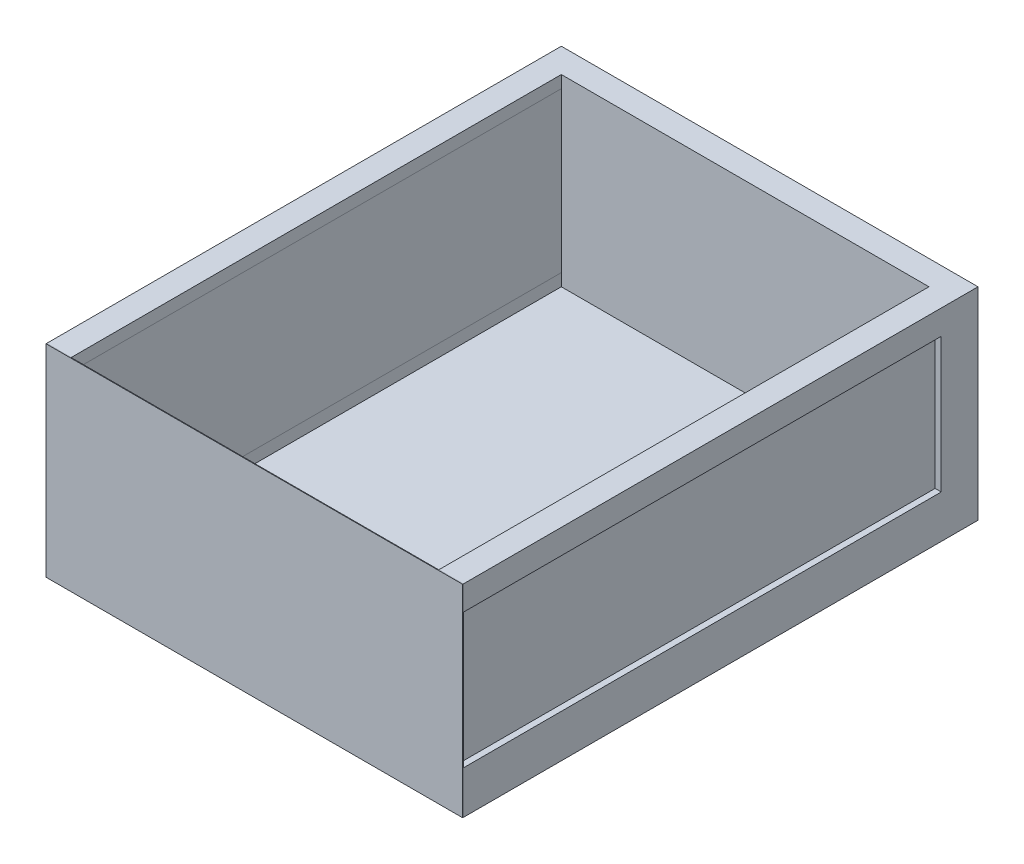
ISO-10303-21;
HEADER;
FILE_DESCRIPTION(('STEP AP214'),'2;1');
FILE_NAME('part.step','',(''),(''),'','','');
FILE_SCHEMA(('AUTOMOTIVE_DESIGN { 1 0 10303 214 1 1 1 1 }'));
ENDSEC;
DATA;
#1=APPLICATION_CONTEXT('core data for automotive mechanical design processes');
#2=APPLICATION_PROTOCOL_DEFINITION('international standard','automotive_design',2000,#1);
#3=PRODUCT_CONTEXT('',#1,'mechanical');
#4=PRODUCT('Part','Part','',(#3));
#5=PRODUCT_RELATED_PRODUCT_CATEGORY('part','',(#4));
#6=PRODUCT_DEFINITION_FORMATION('','',#4);
#7=PRODUCT_DEFINITION_CONTEXT('part definition',#1,'design');
#8=PRODUCT_DEFINITION('design','',#6,#7);
#9=PRODUCT_DEFINITION_SHAPE('','',#8);
#10=(LENGTH_UNIT() NAMED_UNIT(*) SI_UNIT(.MILLI.,.METRE.));
#11=(NAMED_UNIT(*) PLANE_ANGLE_UNIT() SI_UNIT($,.RADIAN.));
#12=(NAMED_UNIT(*) SI_UNIT($,.STERADIAN.) SOLID_ANGLE_UNIT());
#13=UNCERTAINTY_MEASURE_WITH_UNIT(LENGTH_MEASURE(1.E-05),#10,'distance_accuracy_value','');
#14=(GEOMETRIC_REPRESENTATION_CONTEXT(3) GLOBAL_UNCERTAINTY_ASSIGNED_CONTEXT((#13)) GLOBAL_UNIT_ASSIGNED_CONTEXT((#10,
#11,#12)) REPRESENTATION_CONTEXT('',''));
#15=CARTESIAN_POINT('',(0.,0.,0.));
#16=DIRECTION('',(0.,0.,1.));
#17=DIRECTION('',(1.,0.,0.));
#18=AXIS2_PLACEMENT_3D('',#15,#16,#17);
#19=CARTESIAN_POINT('',(-34.,33.,42.1));
#20=DIRECTION('',(1.,0.,0.));
#21=DIRECTION('',(0.,0.,-1.));
#22=AXIS2_PLACEMENT_3D('',#19,#20,#21);
#23=PLANE('',#22);
#24=DIRECTION('',(0.,-1.,0.));
#25=VECTOR('',#24,1.);
#26=CARTESIAN_POINT('',(-34.,33.,42.));
#27=LINE('',#26,#25);
#28=CARTESIAN_POINT('',(-34.,33.,42.));
#29=VERTEX_POINT('',#28);
#30=CARTESIAN_POINT('',(-34.,0.,42.));
#31=VERTEX_POINT('',#30);
#32=EDGE_CURVE('E113',#29,#31,#27,.T.);
#33=ORIENTED_EDGE('',*,*,#32,.T.);
#34=DIRECTION('',(0.,0.,-1.));
#35=VECTOR('',#34,1.);
#36=CARTESIAN_POINT('',(-34.,0.,42.1));
#37=LINE('',#36,#35);
#38=CARTESIAN_POINT('',(-34.,0.,42.1));
#39=VERTEX_POINT('',#38);
#40=EDGE_CURVE('E12',#39,#31,#37,.T.);
#41=ORIENTED_EDGE('',*,*,#40,.F.);
#42=DIRECTION('',(0.,-1.,0.));
#43=VECTOR('',#42,1.);
#44=CARTESIAN_POINT('',(-34.,33.,42.1));
#45=LINE('',#44,#43);
#46=CARTESIAN_POINT('',(-34.,33.,42.1));
#47=VERTEX_POINT('',#46);
#48=EDGE_CURVE('E101',#47,#39,#45,.T.);
#49=ORIENTED_EDGE('',*,*,#48,.F.);
#50=DIRECTION('',(0.,0.,-1.));
#51=VECTOR('',#50,1.);
#52=CARTESIAN_POINT('',(-34.,33.,42.1));
#53=LINE('',#52,#51);
#54=EDGE_CURVE('E109',#47,#29,#53,.T.);
#55=ORIENTED_EDGE('',*,*,#54,.T.);
#56=EDGE_LOOP('',(#33,#41,#49,#55));
#57=FACE_BOUND('',#56,.T.);
#58=ADVANCED_FACE('F50',(#57),#23,.F.);
#59=CARTESIAN_POINT('',(-34.,0.,42.1));
#60=DIRECTION('',(0.,1.,0.));
#61=DIRECTION('',(0.,0.,1.));
#62=AXIS2_PLACEMENT_3D('',#59,#60,#61);
#63=PLANE('',#62);
#64=DIRECTION('',(1.,0.,0.));
#65=VECTOR('',#64,1.);
#66=CARTESIAN_POINT('',(-34.,0.,42.));
#67=LINE('',#66,#65);
#68=CARTESIAN_POINT('',(34.,0.,42.));
#69=VERTEX_POINT('',#68);
#70=EDGE_CURVE('E105',#31,#69,#67,.T.);
#71=ORIENTED_EDGE('',*,*,#70,.T.);
#72=DIRECTION('',(0.,0.,-1.));
#73=VECTOR('',#72,1.);
#74=CARTESIAN_POINT('',(34.,0.,42.1));
#75=LINE('',#74,#73);
#76=CARTESIAN_POINT('',(34.,0.,42.1));
#77=VERTEX_POINT('',#76);
#78=EDGE_CURVE('E58',#77,#69,#75,.T.);
#79=ORIENTED_EDGE('',*,*,#78,.F.);
#80=DIRECTION('',(1.,0.,0.));
#81=VECTOR('',#80,1.);
#82=CARTESIAN_POINT('',(-34.,0.,42.1));
#83=LINE('',#82,#81);
#84=EDGE_CURVE('E96',#39,#77,#83,.T.);
#85=ORIENTED_EDGE('',*,*,#84,.F.);
#86=ORIENTED_EDGE('',*,*,#40,.T.);
#87=EDGE_LOOP('',(#71,#79,#85,#86));
#88=FACE_BOUND('',#87,.T.);
#89=ADVANCED_FACE('F104',(#88),#63,.F.);
#90=CARTESIAN_POINT('',(34.,33.,42.1));
#91=DIRECTION('',(-1.,0.,0.));
#92=DIRECTION('',(0.,0.,1.));
#93=AXIS2_PLACEMENT_3D('',#90,#91,#92);
#94=PLANE('',#93);
#95=DIRECTION('',(0.,1.,0.));
#96=VECTOR('',#95,1.);
#97=CARTESIAN_POINT('',(34.,33.,42.));
#98=LINE('',#97,#96);
#99=CARTESIAN_POINT('',(34.,33.,42.));
#100=VERTEX_POINT('',#99);
#101=EDGE_CURVE('E83',#69,#100,#98,.T.);
#102=ORIENTED_EDGE('',*,*,#101,.T.);
#103=DIRECTION('',(0.,0.,-1.));
#104=VECTOR('',#103,1.);
#105=CARTESIAN_POINT('',(34.,33.,42.1));
#106=LINE('',#105,#104);
#107=CARTESIAN_POINT('',(34.,33.,42.1));
#108=VERTEX_POINT('',#107);
#109=EDGE_CURVE('E106',#108,#100,#106,.T.);
#110=ORIENTED_EDGE('',*,*,#109,.F.);
#111=DIRECTION('',(0.,1.,0.));
#112=VECTOR('',#111,1.);
#113=CARTESIAN_POINT('',(34.,33.,42.1));
#114=LINE('',#113,#112);
#115=EDGE_CURVE('E99',#77,#108,#114,.T.);
#116=ORIENTED_EDGE('',*,*,#115,.F.);
#117=ORIENTED_EDGE('',*,*,#78,.T.);
#118=EDGE_LOOP('',(#102,#110,#116,#117));
#119=FACE_BOUND('',#118,.T.);
#120=ADVANCED_FACE('F107',(#119),#94,.F.);
#121=CARTESIAN_POINT('',(-34.,33.,42.1));
#122=DIRECTION('',(0.,-1.,0.));
#123=DIRECTION('',(0.,0.,-1.));
#124=AXIS2_PLACEMENT_3D('',#121,#122,#123);
#125=PLANE('',#124);
#126=DIRECTION('',(-1.,0.,0.));
#127=VECTOR('',#126,1.);
#128=CARTESIAN_POINT('',(-34.,33.,42.));
#129=LINE('',#128,#127);
#130=EDGE_CURVE('E89',#100,#29,#129,.T.);
#131=ORIENTED_EDGE('',*,*,#130,.T.);
#132=ORIENTED_EDGE('',*,*,#54,.F.);
#133=DIRECTION('',(-1.,0.,0.));
#134=VECTOR('',#133,1.);
#135=CARTESIAN_POINT('',(-34.,33.,42.1));
#136=LINE('',#135,#134);
#137=EDGE_CURVE('E66',#108,#47,#136,.T.);
#138=ORIENTED_EDGE('',*,*,#137,.F.);
#139=ORIENTED_EDGE('',*,*,#109,.T.);
#140=EDGE_LOOP('',(#131,#132,#138,#139));
#141=FACE_BOUND('',#140,.T.);
#142=ADVANCED_FACE('F120',(#141),#125,.F.);
#143=CARTESIAN_POINT('',(0.,0.,42.1));
#144=DIRECTION('',(0.,0.,1.));
#145=DIRECTION('',(1.,0.,0.));
#146=AXIS2_PLACEMENT_3D('',#143,#144,#145);
#147=PLANE('',#146);
#148=ORIENTED_EDGE('',*,*,#48,.T.);
#149=ORIENTED_EDGE('',*,*,#84,.T.);
#150=ORIENTED_EDGE('',*,*,#115,.T.);
#151=ORIENTED_EDGE('',*,*,#137,.T.);
#152=EDGE_LOOP('',(#148,#149,#150,#151));
#153=FACE_BOUND('',#152,.T.);
#154=ADVANCED_FACE('F97',(#153),#147,.T.);
#155=CARTESIAN_POINT('',(0.,0.,42.));
#156=DIRECTION('',(0.,0.,1.));
#157=DIRECTION('',(1.,0.,0.));
#158=AXIS2_PLACEMENT_3D('',#155,#156,#157);
#159=PLANE('',#158);
#160=ORIENTED_EDGE('',*,*,#32,.F.);
#161=ORIENTED_EDGE('',*,*,#130,.F.);
#162=ORIENTED_EDGE('',*,*,#101,.F.);
#163=ORIENTED_EDGE('',*,*,#70,.F.);
#164=EDGE_LOOP('',(#160,#161,#162,#163));
#165=FACE_BOUND('',#164,.T.);
#166=ADVANCED_FACE('F123',(#165),#159,.F.);
#167=CLOSED_SHELL('',(#58,#89,#120,#142,#154,#166));
#168=MANIFOLD_SOLID_BREP('B2',#167);
#169=CARTESIAN_POINT('',(33.,31.,-38.));
#170=DIRECTION('',(0.,0.,-1.));
#171=DIRECTION('',(-1.,0.,0.));
#172=AXIS2_PLACEMENT_3D('',#169,#170,#171);
#173=PLANE('',#172);
#174=DIRECTION('',(0.,-1.,0.));
#175=VECTOR('',#174,1.);
#176=CARTESIAN_POINT('',(30.,31.,-38.));
#177=LINE('',#176,#175);
#178=CARTESIAN_POINT('',(30.,31.,-38.));
#179=VERTEX_POINT('',#178);
#180=CARTESIAN_POINT('',(30.,5.,-38.));
#181=VERTEX_POINT('',#180);
#182=EDGE_CURVE('E248',#179,#181,#177,.T.);
#183=ORIENTED_EDGE('',*,*,#182,.F.);
#184=DIRECTION('',(-1.,0.,0.));
#185=VECTOR('',#184,1.);
#186=CARTESIAN_POINT('',(33.,31.,-38.));
#187=LINE('',#186,#185);
#188=CARTESIAN_POINT('',(33.,31.,-38.));
#189=VERTEX_POINT('',#188);
#190=EDGE_CURVE('E48',#189,#179,#187,.T.);
#191=ORIENTED_EDGE('',*,*,#190,.F.);
#192=DIRECTION('',(0.,-1.,0.));
#193=VECTOR('',#192,1.);
#194=CARTESIAN_POINT('',(33.,31.,-38.));
#195=LINE('',#194,#193);
#196=CARTESIAN_POINT('',(33.,5.,-38.));
#197=VERTEX_POINT('',#196);
#198=EDGE_CURVE('E242',#189,#197,#195,.T.);
#199=ORIENTED_EDGE('',*,*,#198,.T.);
#200=DIRECTION('',(-1.,0.,0.));
#201=VECTOR('',#200,1.);
#202=CARTESIAN_POINT('',(33.,5.,-38.));
#203=LINE('',#202,#201);
#204=EDGE_CURVE('E187',#197,#181,#203,.T.);
#205=ORIENTED_EDGE('',*,*,#204,.T.);
#206=EDGE_LOOP('',(#183,#191,#199,#205));
#207=FACE_BOUND('',#206,.T.);
#208=ADVANCED_FACE('F184',(#207),#173,.T.);
#209=CARTESIAN_POINT('',(33.,31.,-38.));
#210=DIRECTION('',(0.,1.,0.));
#211=DIRECTION('',(0.,0.,1.));
#212=AXIS2_PLACEMENT_3D('',#209,#210,#211);
#213=PLANE('',#212);
#214=DIRECTION('',(0.,0.,-1.));
#215=VECTOR('',#214,1.);
#216=CARTESIAN_POINT('',(30.,31.,-38.));
#217=LINE('',#216,#215);
#218=CARTESIAN_POINT('',(30.,31.,42.));
#219=VERTEX_POINT('',#218);
#220=EDGE_CURVE('E244',#219,#179,#217,.T.);
#221=ORIENTED_EDGE('',*,*,#220,.F.);
#222=DIRECTION('',(-1.,0.,0.));
#223=VECTOR('',#222,1.);
#224=CARTESIAN_POINT('',(33.,31.,42.));
#225=LINE('',#224,#223);
#226=CARTESIAN_POINT('',(33.,31.,42.));
#227=VERTEX_POINT('',#226);
#228=EDGE_CURVE('E193',#227,#219,#225,.T.);
#229=ORIENTED_EDGE('',*,*,#228,.F.);
#230=DIRECTION('',(0.,0.,-1.));
#231=VECTOR('',#230,1.);
#232=CARTESIAN_POINT('',(33.,31.,-38.));
#233=LINE('',#232,#231);
#234=EDGE_CURVE('E239',#227,#189,#233,.T.);
#235=ORIENTED_EDGE('',*,*,#234,.T.);
#236=ORIENTED_EDGE('',*,*,#190,.T.);
#237=EDGE_LOOP('',(#221,#229,#235,#236));
#238=FACE_BOUND('',#237,.T.);
#239=ADVANCED_FACE('F258',(#238),#213,.T.);
#240=CARTESIAN_POINT('',(33.,31.,42.));
#241=DIRECTION('',(0.,0.,1.));
#242=DIRECTION('',(1.,0.,0.));
#243=AXIS2_PLACEMENT_3D('',#240,#241,#242);
#244=PLANE('',#243);
#245=DIRECTION('',(0.,1.,0.));
#246=VECTOR('',#245,1.);
#247=CARTESIAN_POINT('',(30.,31.,42.));
#248=LINE('',#247,#246);
#249=CARTESIAN_POINT('',(30.,5.,42.));
#250=VERTEX_POINT('',#249);
#251=EDGE_CURVE('E234',#250,#219,#248,.T.);
#252=ORIENTED_EDGE('',*,*,#251,.F.);
#253=DIRECTION('',(-1.,0.,0.));
#254=VECTOR('',#253,1.);
#255=CARTESIAN_POINT('',(33.,5.,42.));
#256=LINE('',#255,#254);
#257=CARTESIAN_POINT('',(33.,5.,42.));
#258=VERTEX_POINT('',#257);
#259=EDGE_CURVE('E229',#258,#250,#256,.T.);
#260=ORIENTED_EDGE('',*,*,#259,.F.);
#261=DIRECTION('',(0.,1.,0.));
#262=VECTOR('',#261,1.);
#263=CARTESIAN_POINT('',(33.,31.,42.));
#264=LINE('',#263,#262);
#265=EDGE_CURVE('E232',#258,#227,#264,.T.);
#266=ORIENTED_EDGE('',*,*,#265,.T.);
#267=ORIENTED_EDGE('',*,*,#228,.T.);
#268=EDGE_LOOP('',(#252,#260,#266,#267));
#269=FACE_BOUND('',#268,.T.);
#270=ADVANCED_FACE('F231',(#269),#244,.T.);
#271=CARTESIAN_POINT('',(33.,5.,-38.));
#272=DIRECTION('',(0.,-1.,0.));
#273=DIRECTION('',(0.,0.,-1.));
#274=AXIS2_PLACEMENT_3D('',#271,#272,#273);
#275=PLANE('',#274);
#276=DIRECTION('',(0.,0.,1.));
#277=VECTOR('',#276,1.);
#278=CARTESIAN_POINT('',(30.,5.,-38.));
#279=LINE('',#278,#277);
#280=EDGE_CURVE('E251',#181,#250,#279,.T.);
#281=ORIENTED_EDGE('',*,*,#280,.F.);
#282=ORIENTED_EDGE('',*,*,#204,.F.);
#283=DIRECTION('',(0.,0.,1.));
#284=VECTOR('',#283,1.);
#285=CARTESIAN_POINT('',(33.,5.,-38.));
#286=LINE('',#285,#284);
#287=EDGE_CURVE('E238',#197,#258,#286,.T.);
#288=ORIENTED_EDGE('',*,*,#287,.T.);
#289=ORIENTED_EDGE('',*,*,#259,.T.);
#290=EDGE_LOOP('',(#281,#282,#288,#289));
#291=FACE_BOUND('',#290,.T.);
#292=ADVANCED_FACE('F241',(#291),#275,.T.);
#293=CARTESIAN_POINT('',(33.,0.,0.));
#294=DIRECTION('',(-1.,0.,0.));
#295=DIRECTION('',(0.,0.,1.));
#296=AXIS2_PLACEMENT_3D('',#293,#294,#295);
#297=PLANE('',#296);
#298=ORIENTED_EDGE('',*,*,#198,.F.);
#299=ORIENTED_EDGE('',*,*,#234,.F.);
#300=ORIENTED_EDGE('',*,*,#265,.F.);
#301=ORIENTED_EDGE('',*,*,#287,.F.);
#302=EDGE_LOOP('',(#298,#299,#300,#301));
#303=FACE_BOUND('',#302,.T.);
#304=ADVANCED_FACE('F237',(#303),#297,.F.);
#305=CARTESIAN_POINT('',(30.,0.,0.));
#306=DIRECTION('',(-1.,0.,0.));
#307=DIRECTION('',(0.,0.,1.));
#308=AXIS2_PLACEMENT_3D('',#305,#306,#307);
#309=PLANE('',#308);
#310=ORIENTED_EDGE('',*,*,#182,.T.);
#311=ORIENTED_EDGE('',*,*,#280,.T.);
#312=ORIENTED_EDGE('',*,*,#251,.T.);
#313=ORIENTED_EDGE('',*,*,#220,.T.);
#314=EDGE_LOOP('',(#310,#311,#312,#313));
#315=FACE_BOUND('',#314,.T.);
#316=ADVANCED_FACE('F257',(#315),#309,.T.);
#317=CLOSED_SHELL('',(#208,#239,#270,#292,#304,#316));
#318=MANIFOLD_SOLID_BREP('B6',#317);
#319=CARTESIAN_POINT('',(-33.,5.,-38.));
#320=DIRECTION('',(0.,0.,-1.));
#321=DIRECTION('',(-1.,0.,0.));
#322=AXIS2_PLACEMENT_3D('',#319,#320,#321);
#323=PLANE('',#322);
#324=DIRECTION('',(0.,1.,0.));
#325=VECTOR('',#324,1.);
#326=CARTESIAN_POINT('',(-30.,5.,-38.));
#327=LINE('',#326,#325);
#328=CARTESIAN_POINT('',(-30.,5.,-38.));
#329=VERTEX_POINT('',#328);
#330=CARTESIAN_POINT('',(-30.,31.,-38.));
#331=VERTEX_POINT('',#330);
#332=EDGE_CURVE('E381',#329,#331,#327,.T.);
#333=ORIENTED_EDGE('',*,*,#332,.F.);
#334=DIRECTION('',(1.,0.,0.));
#335=VECTOR('',#334,1.);
#336=CARTESIAN_POINT('',(-33.,5.,-38.));
#337=LINE('',#336,#335);
#338=CARTESIAN_POINT('',(-33.,5.,-38.));
#339=VERTEX_POINT('',#338);
#340=EDGE_CURVE('E182',#339,#329,#337,.T.);
#341=ORIENTED_EDGE('',*,*,#340,.F.);
#342=DIRECTION('',(0.,1.,0.));
#343=VECTOR('',#342,1.);
#344=CARTESIAN_POINT('',(-33.,5.,-38.));
#345=LINE('',#344,#343);
#346=CARTESIAN_POINT('',(-33.,31.,-38.));
#347=VERTEX_POINT('',#346);
#348=EDGE_CURVE('E375',#339,#347,#345,.T.);
#349=ORIENTED_EDGE('',*,*,#348,.T.);
#350=DIRECTION('',(1.,0.,0.));
#351=VECTOR('',#350,1.);
#352=CARTESIAN_POINT('',(-33.,31.,-38.));
#353=LINE('',#352,#351);
#354=EDGE_CURVE('E320',#347,#331,#353,.T.);
#355=ORIENTED_EDGE('',*,*,#354,.T.);
#356=EDGE_LOOP('',(#333,#341,#349,#355));
#357=FACE_BOUND('',#356,.T.);
#358=ADVANCED_FACE('F317',(#357),#323,.T.);
#359=CARTESIAN_POINT('',(-33.,5.,-38.));
#360=DIRECTION('',(0.,-1.,0.));
#361=DIRECTION('',(0.,0.,-1.));
#362=AXIS2_PLACEMENT_3D('',#359,#360,#361);
#363=PLANE('',#362);
#364=DIRECTION('',(0.,0.,-1.));
#365=VECTOR('',#364,1.);
#366=CARTESIAN_POINT('',(-30.,5.,-38.));
#367=LINE('',#366,#365);
#368=CARTESIAN_POINT('',(-30.,4.99999999999999,42.));
#369=VERTEX_POINT('',#368);
#370=EDGE_CURVE('E377',#369,#329,#367,.T.);
#371=ORIENTED_EDGE('',*,*,#370,.F.);
#372=DIRECTION('',(1.,0.,0.));
#373=VECTOR('',#372,1.);
#374=CARTESIAN_POINT('',(-33.,4.99999999999999,42.));
#375=LINE('',#374,#373);
#376=CARTESIAN_POINT('',(-33.,4.99999999999999,42.));
#377=VERTEX_POINT('',#376);
#378=EDGE_CURVE('E326',#377,#369,#375,.T.);
#379=ORIENTED_EDGE('',*,*,#378,.F.);
#380=DIRECTION('',(0.,0.,-1.));
#381=VECTOR('',#380,1.);
#382=CARTESIAN_POINT('',(-33.,5.,-38.));
#383=LINE('',#382,#381);
#384=EDGE_CURVE('E372',#377,#339,#383,.T.);
#385=ORIENTED_EDGE('',*,*,#384,.T.);
#386=ORIENTED_EDGE('',*,*,#340,.T.);
#387=EDGE_LOOP('',(#371,#379,#385,#386));
#388=FACE_BOUND('',#387,.T.);
#389=ADVANCED_FACE('F391',(#388),#363,.T.);
#390=CARTESIAN_POINT('',(-33.,4.99999999999999,42.));
#391=DIRECTION('',(0.,0.,1.));
#392=DIRECTION('',(1.,0.,0.));
#393=AXIS2_PLACEMENT_3D('',#390,#391,#392);
#394=PLANE('',#393);
#395=DIRECTION('',(0.,-1.,0.));
#396=VECTOR('',#395,1.);
#397=CARTESIAN_POINT('',(-30.,4.99999999999999,42.));
#398=LINE('',#397,#396);
#399=CARTESIAN_POINT('',(-30.,31.,42.));
#400=VERTEX_POINT('',#399);
#401=EDGE_CURVE('E367',#400,#369,#398,.T.);
#402=ORIENTED_EDGE('',*,*,#401,.F.);
#403=DIRECTION('',(1.,0.,0.));
#404=VECTOR('',#403,1.);
#405=CARTESIAN_POINT('',(-33.,31.,42.));
#406=LINE('',#405,#404);
#407=CARTESIAN_POINT('',(-33.,31.,42.));
#408=VERTEX_POINT('',#407);
#409=EDGE_CURVE('E362',#408,#400,#406,.T.);
#410=ORIENTED_EDGE('',*,*,#409,.F.);
#411=DIRECTION('',(0.,-1.,0.));
#412=VECTOR('',#411,1.);
#413=CARTESIAN_POINT('',(-33.,4.99999999999999,42.));
#414=LINE('',#413,#412);
#415=EDGE_CURVE('E365',#408,#377,#414,.T.);
#416=ORIENTED_EDGE('',*,*,#415,.T.);
#417=ORIENTED_EDGE('',*,*,#378,.T.);
#418=EDGE_LOOP('',(#402,#410,#416,#417));
#419=FACE_BOUND('',#418,.T.);
#420=ADVANCED_FACE('F364',(#419),#394,.T.);
#421=CARTESIAN_POINT('',(-33.,31.,-38.));
#422=DIRECTION('',(0.,1.,0.));
#423=DIRECTION('',(0.,0.,1.));
#424=AXIS2_PLACEMENT_3D('',#421,#422,#423);
#425=PLANE('',#424);
#426=DIRECTION('',(0.,0.,1.));
#427=VECTOR('',#426,1.);
#428=CARTESIAN_POINT('',(-30.,31.,-38.));
#429=LINE('',#428,#427);
#430=EDGE_CURVE('E384',#331,#400,#429,.T.);
#431=ORIENTED_EDGE('',*,*,#430,.F.);
#432=ORIENTED_EDGE('',*,*,#354,.F.);
#433=DIRECTION('',(0.,0.,1.));
#434=VECTOR('',#433,1.);
#435=CARTESIAN_POINT('',(-33.,31.,-38.));
#436=LINE('',#435,#434);
#437=EDGE_CURVE('E371',#347,#408,#436,.T.);
#438=ORIENTED_EDGE('',*,*,#437,.T.);
#439=ORIENTED_EDGE('',*,*,#409,.T.);
#440=EDGE_LOOP('',(#431,#432,#438,#439));
#441=FACE_BOUND('',#440,.T.);
#442=ADVANCED_FACE('F374',(#441),#425,.T.);
#443=CARTESIAN_POINT('',(-33.,0.,0.));
#444=DIRECTION('',(1.,0.,0.));
#445=DIRECTION('',(0.,0.,-1.));
#446=AXIS2_PLACEMENT_3D('',#443,#444,#445);
#447=PLANE('',#446);
#448=ORIENTED_EDGE('',*,*,#348,.F.);
#449=ORIENTED_EDGE('',*,*,#384,.F.);
#450=ORIENTED_EDGE('',*,*,#415,.F.);
#451=ORIENTED_EDGE('',*,*,#437,.F.);
#452=EDGE_LOOP('',(#448,#449,#450,#451));
#453=FACE_BOUND('',#452,.T.);
#454=ADVANCED_FACE('F370',(#453),#447,.F.);
#455=CARTESIAN_POINT('',(-30.,0.,0.));
#456=DIRECTION('',(1.,0.,0.));
#457=DIRECTION('',(0.,0.,-1.));
#458=AXIS2_PLACEMENT_3D('',#455,#456,#457);
#459=PLANE('',#458);
#460=ORIENTED_EDGE('',*,*,#332,.T.);
#461=ORIENTED_EDGE('',*,*,#430,.T.);
#462=ORIENTED_EDGE('',*,*,#401,.T.);
#463=ORIENTED_EDGE('',*,*,#370,.T.);
#464=EDGE_LOOP('',(#460,#461,#462,#463));
#465=FACE_BOUND('',#464,.T.);
#466=ADVANCED_FACE('F390',(#465),#459,.T.);
#467=CLOSED_SHELL('',(#358,#389,#420,#442,#454,#466));
#468=MANIFOLD_SOLID_BREP('B42',#467);
#469=CARTESIAN_POINT('',(-34.,3.,42.));
#470=DIRECTION('',(0.,0.,-1.));
#471=DIRECTION('',(-1.,0.,0.));
#472=AXIS2_PLACEMENT_3D('',#469,#470,#471);
#473=PLANE('',#472);
#474=DIRECTION('',(0.,1.,0.));
#475=VECTOR('',#474,1.);
#476=CARTESIAN_POINT('',(33.,31.,42.));
#477=LINE('',#476,#475);
#478=CARTESIAN_POINT('',(33.,29.,42.));
#479=VERTEX_POINT('',#478);
#480=CARTESIAN_POINT('',(33.,31.,42.));
#481=VERTEX_POINT('',#480);
#482=EDGE_CURVE('E630',#479,#481,#477,.T.);
#483=ORIENTED_EDGE('',*,*,#482,.F.);
#484=DIRECTION('',(1.,0.,0.));
#485=VECTOR('',#484,1.);
#486=CARTESIAN_POINT('',(33.,29.,42.));
#487=LINE('',#486,#485);
#488=CARTESIAN_POINT('',(34.,29.,42.));
#489=VERTEX_POINT('',#488);
#490=EDGE_CURVE('E642',#479,#489,#487,.T.);
#491=ORIENTED_EDGE('',*,*,#490,.T.);
#492=DIRECTION('',(0.,-1.,0.));
#493=VECTOR('',#492,1.);
#494=CARTESIAN_POINT('',(34.,3.,42.));
#495=LINE('',#494,#493);
#496=CARTESIAN_POINT('',(34.,33.,42.));
#497=VERTEX_POINT('',#496);
#498=EDGE_CURVE('E758',#497,#489,#495,.T.);
#499=ORIENTED_EDGE('',*,*,#498,.F.);
#500=DIRECTION('',(1.,0.,0.));
#501=VECTOR('',#500,1.);
#502=CARTESIAN_POINT('',(34.,33.,42.));
#503=LINE('',#502,#501);
#504=CARTESIAN_POINT('',(30.,33.,42.));
#505=VERTEX_POINT('',#504);
#506=EDGE_CURVE('E713',#505,#497,#503,.T.);
#507=ORIENTED_EDGE('',*,*,#506,.F.);
#508=DIRECTION('',(0.,-1.,0.));
#509=VECTOR('',#508,1.);
#510=CARTESIAN_POINT('',(30.,33.,42.));
#511=LINE('',#510,#509);
#512=CARTESIAN_POINT('',(30.,31.,42.));
#513=VERTEX_POINT('',#512);
#514=EDGE_CURVE('E730',#505,#513,#511,.T.);
#515=ORIENTED_EDGE('',*,*,#514,.T.);
#516=DIRECTION('',(-1.,0.,0.));
#517=VECTOR('',#516,1.);
#518=CARTESIAN_POINT('',(33.,31.,42.));
#519=LINE('',#518,#517);
#520=EDGE_CURVE('E464',#481,#513,#519,.T.);
#521=ORIENTED_EDGE('',*,*,#520,.F.);
#522=EDGE_LOOP('',(#483,#491,#499,#507,#515,#521));
#523=FACE_BOUND('',#522,.T.);
#524=ADVANCED_FACE('F441',(#523),#473,.F.);
#525=CARTESIAN_POINT('',(30.,33.,-38.));
#526=DIRECTION('',(1.,0.,0.));
#527=DIRECTION('',(0.,0.,-1.));
#528=AXIS2_PLACEMENT_3D('',#525,#526,#527);
#529=PLANE('',#528);
#530=CARTESIAN_POINT('',(30.,5.,42.));
#531=VERTEX_POINT('',#530);
#532=CARTESIAN_POINT('',(30.,3.,42.));
#533=VERTEX_POINT('',#532);
#534=EDGE_CURVE('E722',#531,#533,#511,.T.);
#535=ORIENTED_EDGE('',*,*,#534,.F.);
#536=DIRECTION('',(0.,0.,1.));
#537=VECTOR('',#536,1.);
#538=CARTESIAN_POINT('',(30.,5.,42.));
#539=LINE('',#538,#537);
#540=CARTESIAN_POINT('',(30.,4.99999999999999,-38.));
#541=VERTEX_POINT('',#540);
#542=EDGE_CURVE('E635',#541,#531,#539,.T.);
#543=ORIENTED_EDGE('',*,*,#542,.F.);
#544=DIRECTION('',(0.,-1.,0.));
#545=VECTOR('',#544,1.);
#546=CARTESIAN_POINT('',(30.,33.,-38.));
#547=LINE('',#546,#545);
#548=CARTESIAN_POINT('',(30.,3.,-38.));
#549=VERTEX_POINT('',#548);
#550=EDGE_CURVE('E733',#541,#549,#547,.T.);
#551=ORIENTED_EDGE('',*,*,#550,.T.);
#552=DIRECTION('',(0.,0.,1.));
#553=VECTOR('',#552,1.);
#554=CARTESIAN_POINT('',(30.,3.,-38.));
#555=LINE('',#554,#553);
#556=EDGE_CURVE('E705',#549,#533,#555,.T.);
#557=ORIENTED_EDGE('',*,*,#556,.T.);
#558=EDGE_LOOP('',(#535,#543,#551,#557));
#559=FACE_BOUND('',#558,.T.);
#560=ADVANCED_FACE('F838',(#559),#529,.F.);
#561=DIRECTION('',(0.,-1.,0.));
#562=VECTOR('',#561,1.);
#563=CARTESIAN_POINT('',(-33.,31.,42.));
#564=LINE('',#563,#562);
#565=CARTESIAN_POINT('',(-33.,31.,42.));
#566=VERTEX_POINT('',#565);
#567=CARTESIAN_POINT('',(-33.,29.,42.));
#568=VERTEX_POINT('',#567);
#569=EDGE_CURVE('E652',#566,#568,#564,.T.);
#570=ORIENTED_EDGE('',*,*,#569,.F.);
#571=DIRECTION('',(1.,0.,0.));
#572=VECTOR('',#571,1.);
#573=CARTESIAN_POINT('',(-33.,31.,42.));
#574=LINE('',#573,#572);
#575=CARTESIAN_POINT('',(-30.,31.,42.));
#576=VERTEX_POINT('',#575);
#577=EDGE_CURVE('E669',#566,#576,#574,.T.);
#578=ORIENTED_EDGE('',*,*,#577,.T.);
#579=DIRECTION('',(0.,-1.,0.));
#580=VECTOR('',#579,1.);
#581=CARTESIAN_POINT('',(-30.,33.,42.));
#582=LINE('',#581,#580);
#583=CARTESIAN_POINT('',(-30.,33.,42.));
#584=VERTEX_POINT('',#583);
#585=EDGE_CURVE('E742',#584,#576,#582,.T.);
#586=ORIENTED_EDGE('',*,*,#585,.F.);
#587=DIRECTION('',(1.,0.,0.));
#588=VECTOR('',#587,1.);
#589=CARTESIAN_POINT('',(-30.,33.,42.));
#590=LINE('',#589,#588);
#591=CARTESIAN_POINT('',(-34.,33.,42.));
#592=VERTEX_POINT('',#591);
#593=EDGE_CURVE('E704',#592,#584,#590,.T.);
#594=ORIENTED_EDGE('',*,*,#593,.F.);
#595=DIRECTION('',(0.,-1.,0.));
#596=VECTOR('',#595,1.);
#597=CARTESIAN_POINT('',(-34.,3.,42.));
#598=LINE('',#597,#596);
#599=CARTESIAN_POINT('',(-34.,29.,42.));
#600=VERTEX_POINT('',#599);
#601=EDGE_CURVE('E762',#592,#600,#598,.T.);
#602=ORIENTED_EDGE('',*,*,#601,.T.);
#603=DIRECTION('',(-1.,0.,0.));
#604=VECTOR('',#603,1.);
#605=CARTESIAN_POINT('',(-33.,29.,42.));
#606=LINE('',#605,#604);
#607=EDGE_CURVE('E695',#568,#600,#606,.T.);
#608=ORIENTED_EDGE('',*,*,#607,.F.);
#609=EDGE_LOOP('',(#570,#578,#586,#594,#602,#608));
#610=FACE_BOUND('',#609,.T.);
#611=ADVANCED_FACE('F796',(#610),#473,.F.);
#612=CARTESIAN_POINT('',(-30.,33.,-38.));
#613=DIRECTION('',(-1.,0.,0.));
#614=DIRECTION('',(0.,0.,1.));
#615=AXIS2_PLACEMENT_3D('',#612,#613,#614);
#616=PLANE('',#615);
#617=ORIENTED_EDGE('',*,*,#585,.T.);
#618=DIRECTION('',(0.,0.,1.));
#619=VECTOR('',#618,1.);
#620=CARTESIAN_POINT('',(-30.,31.,42.));
#621=LINE('',#620,#619);
#622=CARTESIAN_POINT('',(-30.,31.,-38.));
#623=VERTEX_POINT('',#622);
#624=EDGE_CURVE('E667',#623,#576,#621,.T.);
#625=ORIENTED_EDGE('',*,*,#624,.F.);
#626=DIRECTION('',(0.,-1.,0.));
#627=VECTOR('',#626,1.);
#628=CARTESIAN_POINT('',(-30.,33.,-38.));
#629=LINE('',#628,#627);
#630=CARTESIAN_POINT('',(-30.,33.,-38.));
#631=VERTEX_POINT('',#630);
#632=EDGE_CURVE('E738',#631,#623,#629,.T.);
#633=ORIENTED_EDGE('',*,*,#632,.F.);
#634=DIRECTION('',(0.,0.,-1.));
#635=VECTOR('',#634,1.);
#636=CARTESIAN_POINT('',(-30.,33.,-38.));
#637=LINE('',#636,#635);
#638=EDGE_CURVE('E707',#584,#631,#637,.T.);
#639=ORIENTED_EDGE('',*,*,#638,.F.);
#640=EDGE_LOOP('',(#617,#625,#633,#639));
#641=FACE_BOUND('',#640,.T.);
#642=ADVANCED_FACE('F860',(#641),#616,.F.);
#643=CARTESIAN_POINT('',(34.,3.,-42.));
#644=DIRECTION('',(-1.,0.,0.));
#645=DIRECTION('',(0.,0.,1.));
#646=AXIS2_PLACEMENT_3D('',#643,#644,#645);
#647=PLANE('',#646);
#648=ORIENTED_EDGE('',*,*,#498,.T.);
#649=DIRECTION('',(0.,0.,1.));
#650=VECTOR('',#649,1.);
#651=CARTESIAN_POINT('',(34.,29.,42.));
#652=LINE('',#651,#650);
#653=CARTESIAN_POINT('',(34.,29.,-36.));
#654=VERTEX_POINT('',#653);
#655=EDGE_CURVE('E612',#654,#489,#652,.T.);
#656=ORIENTED_EDGE('',*,*,#655,.F.);
#657=DIRECTION('',(0.,1.,0.));
#658=VECTOR('',#657,1.);
#659=CARTESIAN_POINT('',(34.,29.,-36.));
#660=LINE('',#659,#658);
#661=CARTESIAN_POINT('',(34.,7.,-36.));
#662=VERTEX_POINT('',#661);
#663=EDGE_CURVE('E808',#662,#654,#660,.T.);
#664=ORIENTED_EDGE('',*,*,#663,.F.);
#665=DIRECTION('',(0.,0.,-1.));
#666=VECTOR('',#665,1.);
#667=CARTESIAN_POINT('',(34.,7.,42.));
#668=LINE('',#667,#666);
#669=CARTESIAN_POINT('',(34.,7.,42.));
#670=VERTEX_POINT('',#669);
#671=EDGE_CURVE('E805',#670,#662,#668,.T.);
#672=ORIENTED_EDGE('',*,*,#671,.F.);
#673=CARTESIAN_POINT('',(34.,0.,42.));
#674=VERTEX_POINT('',#673);
#675=EDGE_CURVE('E621',#670,#674,#495,.T.);
#676=ORIENTED_EDGE('',*,*,#675,.T.);
#677=DIRECTION('',(0.,0.,-1.));
#678=VECTOR('',#677,1.);
#679=CARTESIAN_POINT('',(34.,0.,-42.));
#680=LINE('',#679,#678);
#681=CARTESIAN_POINT('',(34.,0.,-42.));
#682=VERTEX_POINT('',#681);
#683=EDGE_CURVE('E745',#674,#682,#680,.T.);
#684=ORIENTED_EDGE('',*,*,#683,.T.);
#685=DIRECTION('',(0.,-1.,0.));
#686=VECTOR('',#685,1.);
#687=CARTESIAN_POINT('',(34.,3.,-42.));
#688=LINE('',#687,#686);
#689=CARTESIAN_POINT('',(34.,33.,-42.));
#690=VERTEX_POINT('',#689);
#691=EDGE_CURVE('E315',#690,#682,#688,.T.);
#692=ORIENTED_EDGE('',*,*,#691,.F.);
#693=DIRECTION('',(0.,0.,-1.));
#694=VECTOR('',#693,1.);
#695=CARTESIAN_POINT('',(34.,33.,42.));
#696=LINE('',#695,#694);
#697=EDGE_CURVE('E716',#497,#690,#696,.T.);
#698=ORIENTED_EDGE('',*,*,#697,.F.);
#699=EDGE_LOOP('',(#648,#656,#664,#672,#676,#684,#692,#698));
#700=FACE_BOUND('',#699,.T.);
#701=ADVANCED_FACE('F443',(#700),#647,.F.);
#702=CARTESIAN_POINT('',(-34.,3.,-42.));
#703=DIRECTION('',(0.,0.,1.));
#704=DIRECTION('',(1.,0.,0.));
#705=AXIS2_PLACEMENT_3D('',#702,#703,#704);
#706=PLANE('',#705);
#707=DIRECTION('',(-1.,0.,0.));
#708=VECTOR('',#707,1.);
#709=CARTESIAN_POINT('',(-34.,0.,-42.));
#710=LINE('',#709,#708);
#711=CARTESIAN_POINT('',(-34.,0.,-42.));
#712=VERTEX_POINT('',#711);
#713=EDGE_CURVE('E752',#682,#712,#710,.T.);
#714=ORIENTED_EDGE('',*,*,#713,.T.);
#715=DIRECTION('',(0.,-1.,0.));
#716=VECTOR('',#715,1.);
#717=CARTESIAN_POINT('',(-34.,3.,-42.));
#718=LINE('',#717,#716);
#719=CARTESIAN_POINT('',(-34.,33.,-42.));
#720=VERTEX_POINT('',#719);
#721=EDGE_CURVE('E449',#720,#712,#718,.T.);
#722=ORIENTED_EDGE('',*,*,#721,.F.);
#723=DIRECTION('',(-1.,0.,0.));
#724=VECTOR('',#723,1.);
#725=CARTESIAN_POINT('',(34.,33.,-42.));
#726=LINE('',#725,#724);
#727=EDGE_CURVE('E719',#690,#720,#726,.T.);
#728=ORIENTED_EDGE('',*,*,#727,.F.);
#729=ORIENTED_EDGE('',*,*,#691,.T.);
#730=EDGE_LOOP('',(#714,#722,#728,#729));
#731=FACE_BOUND('',#730,.T.);
#732=ADVANCED_FACE('F802',(#731),#706,.F.);
#733=CARTESIAN_POINT('',(-34.,3.,-42.));
#734=DIRECTION('',(1.,0.,0.));
#735=DIRECTION('',(0.,0.,-1.));
#736=AXIS2_PLACEMENT_3D('',#733,#734,#735);
#737=PLANE('',#736);
#738=DIRECTION('',(0.,-1.,0.));
#739=VECTOR('',#738,1.);
#740=CARTESIAN_POINT('',(-34.,29.,-36.));
#741=LINE('',#740,#739);
#742=CARTESIAN_POINT('',(-34.,29.,-36.));
#743=VERTEX_POINT('',#742);
#744=CARTESIAN_POINT('',(-34.,7.,-36.));
#745=VERTEX_POINT('',#744);
#746=EDGE_CURVE('E672',#743,#745,#741,.T.);
#747=ORIENTED_EDGE('',*,*,#746,.F.);
#748=DIRECTION('',(0.,0.,-1.));
#749=VECTOR('',#748,1.);
#750=CARTESIAN_POINT('',(-34.,29.,-36.));
#751=LINE('',#750,#749);
#752=EDGE_CURVE('E681',#600,#743,#751,.T.);
#753=ORIENTED_EDGE('',*,*,#752,.F.);
#754=ORIENTED_EDGE('',*,*,#601,.F.);
#755=DIRECTION('',(0.,0.,1.));
#756=VECTOR('',#755,1.);
#757=CARTESIAN_POINT('',(-34.,33.,42.));
#758=LINE('',#757,#756);
#759=EDGE_CURVE('E701',#720,#592,#758,.T.);
#760=ORIENTED_EDGE('',*,*,#759,.F.);
#761=ORIENTED_EDGE('',*,*,#721,.T.);
#762=DIRECTION('',(0.,0.,1.));
#763=VECTOR('',#762,1.);
#764=CARTESIAN_POINT('',(-34.,0.,-42.));
#765=LINE('',#764,#763);
#766=CARTESIAN_POINT('',(-34.,0.,42.));
#767=VERTEX_POINT('',#766);
#768=EDGE_CURVE('E754',#712,#767,#765,.T.);
#769=ORIENTED_EDGE('',*,*,#768,.T.);
#770=CARTESIAN_POINT('',(-34.,7.,42.));
#771=VERTEX_POINT('',#770);
#772=EDGE_CURVE('E761',#771,#767,#598,.T.);
#773=ORIENTED_EDGE('',*,*,#772,.F.);
#774=DIRECTION('',(0.,0.,1.));
#775=VECTOR('',#774,1.);
#776=CARTESIAN_POINT('',(-34.,7.,-36.));
#777=LINE('',#776,#775);
#778=EDGE_CURVE('E688',#745,#771,#777,.T.);
#779=ORIENTED_EDGE('',*,*,#778,.F.);
#780=EDGE_LOOP('',(#747,#753,#754,#760,#761,#769,#773,#779));
#781=FACE_BOUND('',#780,.T.);
#782=ADVANCED_FACE('F769',(#781),#737,.F.);
#783=ORIENTED_EDGE('',*,*,#675,.F.);
#784=DIRECTION('',(1.,0.,0.));
#785=VECTOR('',#784,1.);
#786=CARTESIAN_POINT('',(33.,7.,42.));
#787=LINE('',#786,#785);
#788=CARTESIAN_POINT('',(33.,7.,42.));
#789=VERTEX_POINT('',#788);
#790=EDGE_CURVE('E607',#789,#670,#787,.T.);
#791=ORIENTED_EDGE('',*,*,#790,.F.);
#792=CARTESIAN_POINT('',(33.,5.,42.));
#793=VERTEX_POINT('',#792);
#794=EDGE_CURVE('E619',#793,#789,#477,.T.);
#795=ORIENTED_EDGE('',*,*,#794,.F.);
#796=DIRECTION('',(-1.,0.,0.));
#797=VECTOR('',#796,1.);
#798=CARTESIAN_POINT('',(33.,5.,42.));
#799=LINE('',#798,#797);
#800=EDGE_CURVE('E644',#793,#531,#799,.T.);
#801=ORIENTED_EDGE('',*,*,#800,.T.);
#802=ORIENTED_EDGE('',*,*,#534,.T.);
#803=DIRECTION('',(1.,0.,0.));
#804=VECTOR('',#803,1.);
#805=CARTESIAN_POINT('',(-34.,3.,42.));
#806=LINE('',#805,#804);
#807=CARTESIAN_POINT('',(-30.,3.,42.));
#808=VERTEX_POINT('',#807);
#809=EDGE_CURVE('E746',#808,#533,#806,.T.);
#810=ORIENTED_EDGE('',*,*,#809,.F.);
#811=CARTESIAN_POINT('',(-30.,5.,42.));
#812=VERTEX_POINT('',#811);
#813=EDGE_CURVE('E741',#812,#808,#582,.T.);
#814=ORIENTED_EDGE('',*,*,#813,.F.);
#815=DIRECTION('',(1.,0.,0.));
#816=VECTOR('',#815,1.);
#817=CARTESIAN_POINT('',(-33.,5.,42.));
#818=LINE('',#817,#816);
#819=CARTESIAN_POINT('',(-33.,5.,42.));
#820=VERTEX_POINT('',#819);
#821=EDGE_CURVE('E664',#820,#812,#818,.T.);
#822=ORIENTED_EDGE('',*,*,#821,.F.);
#823=CARTESIAN_POINT('',(-33.,7.00000000000001,42.));
#824=VERTEX_POINT('',#823);
#825=EDGE_CURVE('E655',#824,#820,#564,.T.);
#826=ORIENTED_EDGE('',*,*,#825,.F.);
#827=DIRECTION('',(-1.,0.,0.));
#828=VECTOR('',#827,1.);
#829=CARTESIAN_POINT('',(-33.,7.,42.));
#830=LINE('',#829,#828);
#831=EDGE_CURVE('E697',#824,#771,#830,.T.);
#832=ORIENTED_EDGE('',*,*,#831,.T.);
#833=ORIENTED_EDGE('',*,*,#772,.T.);
#834=DIRECTION('',(1.,0.,0.));
#835=VECTOR('',#834,1.);
#836=CARTESIAN_POINT('',(-34.,0.,42.));
#837=LINE('',#836,#835);
#838=EDGE_CURVE('E749',#767,#674,#837,.T.);
#839=ORIENTED_EDGE('',*,*,#838,.T.);
#840=EDGE_LOOP('',(#783,#791,#795,#801,#802,#810,#814,#822,#826,#832,#833,#839));
#841=FACE_BOUND('',#840,.T.);
#842=ADVANCED_FACE('F617',(#841),#473,.F.);
#843=CARTESIAN_POINT('',(0.,3.,0.));
#844=DIRECTION('',(0.,1.,0.));
#845=DIRECTION('',(0.,0.,1.));
#846=AXIS2_PLACEMENT_3D('',#843,#844,#845);
#847=PLANE('',#846);
#848=ORIENTED_EDGE('',*,*,#556,.F.);
#849=DIRECTION('',(1.,0.,0.));
#850=VECTOR('',#849,1.);
#851=CARTESIAN_POINT('',(-30.,3.,-38.));
#852=LINE('',#851,#850);
#853=CARTESIAN_POINT('',(-30.,3.,-38.));
#854=VERTEX_POINT('',#853);
#855=EDGE_CURVE('E725',#854,#549,#852,.T.);
#856=ORIENTED_EDGE('',*,*,#855,.F.);
#857=DIRECTION('',(0.,0.,-1.));
#858=VECTOR('',#857,1.);
#859=CARTESIAN_POINT('',(-30.,3.,-38.));
#860=LINE('',#859,#858);
#861=EDGE_CURVE('E694',#808,#854,#860,.T.);
#862=ORIENTED_EDGE('',*,*,#861,.F.);
#863=ORIENTED_EDGE('',*,*,#809,.T.);
#864=EDGE_LOOP('',(#848,#856,#862,#863));
#865=FACE_BOUND('',#864,.T.);
#866=ADVANCED_FACE('F842',(#865),#847,.T.);
#867=CARTESIAN_POINT('',(0.,0.,0.));
#868=DIRECTION('',(0.,1.,0.));
#869=DIRECTION('',(0.,0.,1.));
#870=AXIS2_PLACEMENT_3D('',#867,#868,#869);
#871=PLANE('',#870);
#872=ORIENTED_EDGE('',*,*,#683,.F.);
#873=ORIENTED_EDGE('',*,*,#838,.F.);
#874=ORIENTED_EDGE('',*,*,#768,.F.);
#875=ORIENTED_EDGE('',*,*,#713,.F.);
#876=EDGE_LOOP('',(#872,#873,#874,#875));
#877=FACE_BOUND('',#876,.T.);
#878=ADVANCED_FACE('F776',(#877),#871,.F.);
#879=CARTESIAN_POINT('',(-30.,5.,-38.));
#880=VERTEX_POINT('',#879);
#881=EDGE_CURVE('E737',#880,#854,#629,.T.);
#882=ORIENTED_EDGE('',*,*,#881,.F.);
#883=DIRECTION('',(0.,0.,-1.));
#884=VECTOR('',#883,1.);
#885=CARTESIAN_POINT('',(-30.,5.,42.));
#886=LINE('',#885,#884);
#887=EDGE_CURVE('E646',#812,#880,#886,.T.);
#888=ORIENTED_EDGE('',*,*,#887,.F.);
#889=ORIENTED_EDGE('',*,*,#813,.T.);
#890=ORIENTED_EDGE('',*,*,#861,.T.);
#891=EDGE_LOOP('',(#882,#888,#889,#890));
#892=FACE_BOUND('',#891,.T.);
#893=ADVANCED_FACE('F848',(#892),#616,.F.);
#894=CARTESIAN_POINT('',(-30.,33.,-38.));
#895=DIRECTION('',(0.,0.,-1.));
#896=DIRECTION('',(-1.,0.,0.));
#897=AXIS2_PLACEMENT_3D('',#894,#895,#896);
#898=PLANE('',#897);
#899=ORIENTED_EDGE('',*,*,#855,.T.);
#900=ORIENTED_EDGE('',*,*,#550,.F.);
#901=DIRECTION('',(-1.,0.,0.));
#902=VECTOR('',#901,1.);
#903=CARTESIAN_POINT('',(33.,4.99999999999999,-38.));
#904=LINE('',#903,#902);
#905=CARTESIAN_POINT('',(33.,4.99999999999999,-38.));
#906=VERTEX_POINT('',#905);
#907=EDGE_CURVE('E647',#906,#541,#904,.T.);
#908=ORIENTED_EDGE('',*,*,#907,.F.);
#909=DIRECTION('',(0.,-1.,0.));
#910=VECTOR('',#909,1.);
#911=CARTESIAN_POINT('',(33.,31.,-38.));
#912=LINE('',#911,#910);
#913=CARTESIAN_POINT('',(33.,31.,-38.));
#914=VERTEX_POINT('',#913);
#915=EDGE_CURVE('E633',#914,#906,#912,.T.);
#916=ORIENTED_EDGE('',*,*,#915,.F.);
#917=DIRECTION('',(-1.,0.,0.));
#918=VECTOR('',#917,1.);
#919=CARTESIAN_POINT('',(33.,31.,-38.));
#920=LINE('',#919,#918);
#921=CARTESIAN_POINT('',(30.,31.,-38.));
#922=VERTEX_POINT('',#921);
#923=EDGE_CURVE('E649',#914,#922,#920,.T.);
#924=ORIENTED_EDGE('',*,*,#923,.T.);
#925=CARTESIAN_POINT('',(30.,33.,-38.));
#926=VERTEX_POINT('',#925);
#927=EDGE_CURVE('E734',#926,#922,#547,.T.);
#928=ORIENTED_EDGE('',*,*,#927,.F.);
#929=DIRECTION('',(1.,0.,0.));
#930=VECTOR('',#929,1.);
#931=CARTESIAN_POINT('',(-30.,33.,-38.));
#932=LINE('',#931,#930);
#933=EDGE_CURVE('E709',#631,#926,#932,.T.);
#934=ORIENTED_EDGE('',*,*,#933,.F.);
#935=ORIENTED_EDGE('',*,*,#632,.T.);
#936=DIRECTION('',(1.,0.,0.));
#937=VECTOR('',#936,1.);
#938=CARTESIAN_POINT('',(-33.,31.,-38.));
#939=LINE('',#938,#937);
#940=CARTESIAN_POINT('',(-33.,31.,-38.));
#941=VERTEX_POINT('',#940);
#942=EDGE_CURVE('E673',#941,#623,#939,.T.);
#943=ORIENTED_EDGE('',*,*,#942,.F.);
#944=DIRECTION('',(0.,1.,0.));
#945=VECTOR('',#944,1.);
#946=CARTESIAN_POINT('',(-33.,31.,-38.));
#947=LINE('',#946,#945);
#948=CARTESIAN_POINT('',(-33.,5.,-38.));
#949=VERTEX_POINT('',#948);
#950=EDGE_CURVE('E658',#949,#941,#947,.T.);
#951=ORIENTED_EDGE('',*,*,#950,.F.);
#952=DIRECTION('',(1.,0.,0.));
#953=VECTOR('',#952,1.);
#954=CARTESIAN_POINT('',(-33.,5.,-38.));
#955=LINE('',#954,#953);
#956=EDGE_CURVE('E675',#949,#880,#955,.T.);
#957=ORIENTED_EDGE('',*,*,#956,.T.);
#958=ORIENTED_EDGE('',*,*,#881,.T.);
#959=EDGE_LOOP('',(#899,#900,#908,#916,#924,#928,#934,#935,#943,#951,#957,#958));
#960=FACE_BOUND('',#959,.T.);
#961=ADVANCED_FACE('F830',(#960),#898,.F.);
#962=ORIENTED_EDGE('',*,*,#927,.T.);
#963=DIRECTION('',(0.,0.,-1.));
#964=VECTOR('',#963,1.);
#965=CARTESIAN_POINT('',(30.,31.,42.));
#966=LINE('',#965,#964);
#967=EDGE_CURVE('E640',#513,#922,#966,.T.);
#968=ORIENTED_EDGE('',*,*,#967,.F.);
#969=ORIENTED_EDGE('',*,*,#514,.F.);
#970=DIRECTION('',(0.,0.,1.));
#971=VECTOR('',#970,1.);
#972=CARTESIAN_POINT('',(30.,33.,-38.));
#973=LINE('',#972,#971);
#974=EDGE_CURVE('E711',#926,#505,#973,.T.);
#975=ORIENTED_EDGE('',*,*,#974,.F.);
#976=EDGE_LOOP('',(#962,#968,#969,#975));
#977=FACE_BOUND('',#976,.T.);
#978=ADVANCED_FACE('F866',(#977),#529,.F.);
#979=CARTESIAN_POINT('',(0.,33.,0.));
#980=DIRECTION('',(0.,1.,0.));
#981=DIRECTION('',(0.,0.,1.));
#982=AXIS2_PLACEMENT_3D('',#979,#980,#981);
#983=PLANE('',#982);
#984=ORIENTED_EDGE('',*,*,#759,.T.);
#985=ORIENTED_EDGE('',*,*,#593,.T.);
#986=ORIENTED_EDGE('',*,*,#638,.T.);
#987=ORIENTED_EDGE('',*,*,#933,.T.);
#988=ORIENTED_EDGE('',*,*,#974,.T.);
#989=ORIENTED_EDGE('',*,*,#506,.T.);
#990=ORIENTED_EDGE('',*,*,#697,.T.);
#991=ORIENTED_EDGE('',*,*,#727,.T.);
#992=EDGE_LOOP('',(#984,#985,#986,#987,#988,#989,#990,#991));
#993=FACE_BOUND('',#992,.T.);
#994=ADVANCED_FACE('F800',(#993),#983,.T.);
#995=CARTESIAN_POINT('',(-33.,29.,-36.));
#996=DIRECTION('',(0.,0.,-1.));
#997=DIRECTION('',(-1.,0.,0.));
#998=AXIS2_PLACEMENT_3D('',#995,#996,#997);
#999=PLANE('',#998);
#1000=ORIENTED_EDGE('',*,*,#746,.T.);
#1001=DIRECTION('',(-1.,0.,0.));
#1002=VECTOR('',#1001,1.);
#1003=CARTESIAN_POINT('',(-33.,7.,-36.));
#1004=LINE('',#1003,#1002);
#1005=CARTESIAN_POINT('',(-33.,7.,-36.));
#1006=VERTEX_POINT('',#1005);
#1007=EDGE_CURVE('E685',#1006,#745,#1004,.T.);
#1008=ORIENTED_EDGE('',*,*,#1007,.F.);
#1009=DIRECTION('',(0.,-1.,0.));
#1010=VECTOR('',#1009,1.);
#1011=CARTESIAN_POINT('',(-33.,29.,-36.));
#1012=LINE('',#1011,#1010);
#1013=CARTESIAN_POINT('',(-33.,29.,-36.));
#1014=VERTEX_POINT('',#1013);
#1015=EDGE_CURVE('E678',#1014,#1006,#1012,.T.);
#1016=ORIENTED_EDGE('',*,*,#1015,.F.);
#1017=DIRECTION('',(-1.,0.,0.));
#1018=VECTOR('',#1017,1.);
#1019=CARTESIAN_POINT('',(-33.,29.,-36.));
#1020=LINE('',#1019,#1018);
#1021=EDGE_CURVE('E692',#1014,#743,#1020,.T.);
#1022=ORIENTED_EDGE('',*,*,#1021,.T.);
#1023=EDGE_LOOP('',(#1000,#1008,#1016,#1022));
#1024=FACE_BOUND('',#1023,.T.);
#1025=ADVANCED_FACE('F787',(#1024),#999,.F.);
#1026=CARTESIAN_POINT('',(-33.,29.,-36.));
#1027=DIRECTION('',(0.,1.,0.));
#1028=DIRECTION('',(0.,0.,1.));
#1029=AXIS2_PLACEMENT_3D('',#1026,#1027,#1028);
#1030=PLANE('',#1029);
#1031=ORIENTED_EDGE('',*,*,#752,.T.);
#1032=ORIENTED_EDGE('',*,*,#1021,.F.);
#1033=DIRECTION('',(0.,0.,-1.));
#1034=VECTOR('',#1033,1.);
#1035=CARTESIAN_POINT('',(-33.,29.,-36.));
#1036=LINE('',#1035,#1034);
#1037=EDGE_CURVE('E683',#568,#1014,#1036,.T.);
#1038=ORIENTED_EDGE('',*,*,#1037,.F.);
#1039=ORIENTED_EDGE('',*,*,#607,.T.);
#1040=EDGE_LOOP('',(#1031,#1032,#1038,#1039));
#1041=FACE_BOUND('',#1040,.T.);
#1042=ADVANCED_FACE('F791',(#1041),#1030,.F.);
#1043=CARTESIAN_POINT('',(-33.,7.,-36.));
#1044=DIRECTION('',(0.,-1.,0.));
#1045=DIRECTION('',(0.,0.,-1.));
#1046=AXIS2_PLACEMENT_3D('',#1043,#1044,#1045);
#1047=PLANE('',#1046);
#1048=ORIENTED_EDGE('',*,*,#778,.T.);
#1049=ORIENTED_EDGE('',*,*,#831,.F.);
#1050=DIRECTION('',(0.,0.,1.));
#1051=VECTOR('',#1050,1.);
#1052=CARTESIAN_POINT('',(-33.,7.,-36.));
#1053=LINE('',#1052,#1051);
#1054=EDGE_CURVE('E680',#1006,#824,#1053,.T.);
#1055=ORIENTED_EDGE('',*,*,#1054,.F.);
#1056=ORIENTED_EDGE('',*,*,#1007,.T.);
#1057=EDGE_LOOP('',(#1048,#1049,#1055,#1056));
#1058=FACE_BOUND('',#1057,.T.);
#1059=ADVANCED_FACE('F782',(#1058),#1047,.F.);
#1060=CARTESIAN_POINT('',(-33.,0.,0.));
#1061=DIRECTION('',(1.,0.,0.));
#1062=DIRECTION('',(0.,0.,-1.));
#1063=AXIS2_PLACEMENT_3D('',#1060,#1061,#1062);
#1064=PLANE('',#1063);
#1065=ORIENTED_EDGE('',*,*,#1037,.T.);
#1066=ORIENTED_EDGE('',*,*,#1015,.T.);
#1067=ORIENTED_EDGE('',*,*,#1054,.T.);
#1068=ORIENTED_EDGE('',*,*,#825,.T.);
#1069=DIRECTION('',(0.,0.,-1.));
#1070=VECTOR('',#1069,1.);
#1071=CARTESIAN_POINT('',(-33.,5.,42.));
#1072=LINE('',#1071,#1070);
#1073=EDGE_CURVE('E654',#820,#949,#1072,.T.);
#1074=ORIENTED_EDGE('',*,*,#1073,.T.);
#1075=ORIENTED_EDGE('',*,*,#950,.T.);
#1076=DIRECTION('',(0.,0.,1.));
#1077=VECTOR('',#1076,1.);
#1078=CARTESIAN_POINT('',(-33.,31.,42.));
#1079=LINE('',#1078,#1077);
#1080=EDGE_CURVE('E661',#941,#566,#1079,.T.);
#1081=ORIENTED_EDGE('',*,*,#1080,.T.);
#1082=ORIENTED_EDGE('',*,*,#569,.T.);
#1083=EDGE_LOOP('',(#1065,#1066,#1067,#1068,#1074,#1075,#1081,#1082));
#1084=FACE_BOUND('',#1083,.T.);
#1085=ADVANCED_FACE('F855',(#1084),#1064,.T.);
#1086=CARTESIAN_POINT('',(-33.,31.,42.));
#1087=DIRECTION('',(0.,1.,0.));
#1088=DIRECTION('',(0.,0.,1.));
#1089=AXIS2_PLACEMENT_3D('',#1086,#1087,#1088);
#1090=PLANE('',#1089);
#1091=ORIENTED_EDGE('',*,*,#624,.T.);
#1092=ORIENTED_EDGE('',*,*,#577,.F.);
#1093=ORIENTED_EDGE('',*,*,#1080,.F.);
#1094=ORIENTED_EDGE('',*,*,#942,.T.);
#1095=EDGE_LOOP('',(#1091,#1092,#1093,#1094));
#1096=FACE_BOUND('',#1095,.T.);
#1097=ADVANCED_FACE('F986',(#1096),#1090,.F.);
#1098=CARTESIAN_POINT('',(-33.,5.,42.));
#1099=DIRECTION('',(0.,-1.,0.));
#1100=DIRECTION('',(0.,0.,-1.));
#1101=AXIS2_PLACEMENT_3D('',#1098,#1099,#1100);
#1102=PLANE('',#1101);
#1103=ORIENTED_EDGE('',*,*,#887,.T.);
#1104=ORIENTED_EDGE('',*,*,#956,.F.);
#1105=ORIENTED_EDGE('',*,*,#1073,.F.);
#1106=ORIENTED_EDGE('',*,*,#821,.T.);
#1107=EDGE_LOOP('',(#1103,#1104,#1105,#1106));
#1108=FACE_BOUND('',#1107,.T.);
#1109=ADVANCED_FACE('F853',(#1108),#1102,.F.);
#1110=CARTESIAN_POINT('',(33.,5.,42.));
#1111=DIRECTION('',(0.,-1.,0.));
#1112=DIRECTION('',(0.,0.,-1.));
#1113=AXIS2_PLACEMENT_3D('',#1110,#1111,#1112);
#1114=PLANE('',#1113);
#1115=ORIENTED_EDGE('',*,*,#542,.T.);
#1116=ORIENTED_EDGE('',*,*,#800,.F.);
#1117=DIRECTION('',(0.,0.,1.));
#1118=VECTOR('',#1117,1.);
#1119=CARTESIAN_POINT('',(33.,5.,42.));
#1120=LINE('',#1119,#1118);
#1121=EDGE_CURVE('E628',#906,#793,#1120,.T.);
#1122=ORIENTED_EDGE('',*,*,#1121,.F.);
#1123=ORIENTED_EDGE('',*,*,#907,.T.);
#1124=EDGE_LOOP('',(#1115,#1116,#1122,#1123));
#1125=FACE_BOUND('',#1124,.T.);
#1126=ADVANCED_FACE('F833',(#1125),#1114,.F.);
#1127=CARTESIAN_POINT('',(33.,31.,42.));
#1128=DIRECTION('',(0.,1.,0.));
#1129=DIRECTION('',(0.,0.,1.));
#1130=AXIS2_PLACEMENT_3D('',#1127,#1128,#1129);
#1131=PLANE('',#1130);
#1132=ORIENTED_EDGE('',*,*,#967,.T.);
#1133=ORIENTED_EDGE('',*,*,#923,.F.);
#1134=DIRECTION('',(0.,0.,-1.));
#1135=VECTOR('',#1134,1.);
#1136=CARTESIAN_POINT('',(33.,31.,42.));
#1137=LINE('',#1136,#1135);
#1138=EDGE_CURVE('E629',#481,#914,#1137,.T.);
#1139=ORIENTED_EDGE('',*,*,#1138,.F.);
#1140=ORIENTED_EDGE('',*,*,#520,.T.);
#1141=EDGE_LOOP('',(#1132,#1133,#1139,#1140));
#1142=FACE_BOUND('',#1141,.T.);
#1143=ADVANCED_FACE('F826',(#1142),#1131,.F.);
#1144=CARTESIAN_POINT('',(33.,0.,0.));
#1145=DIRECTION('',(1.,0.,0.));
#1146=DIRECTION('',(0.,0.,-1.));
#1147=AXIS2_PLACEMENT_3D('',#1144,#1145,#1146);
#1148=PLANE('',#1147);
#1149=DIRECTION('',(0.,1.,0.));
#1150=VECTOR('',#1149,1.);
#1151=CARTESIAN_POINT('',(33.,29.,-36.));
#1152=LINE('',#1151,#1150);
#1153=CARTESIAN_POINT('',(33.,7.,-36.));
#1154=VERTEX_POINT('',#1153);
#1155=CARTESIAN_POINT('',(33.,29.,-36.));
#1156=VERTEX_POINT('',#1155);
#1157=EDGE_CURVE('E456',#1154,#1156,#1152,.T.);
#1158=ORIENTED_EDGE('',*,*,#1157,.T.);
#1159=DIRECTION('',(0.,0.,1.));
#1160=VECTOR('',#1159,1.);
#1161=CARTESIAN_POINT('',(33.,29.,42.));
#1162=LINE('',#1161,#1160);
#1163=EDGE_CURVE('E622',#1156,#479,#1162,.T.);
#1164=ORIENTED_EDGE('',*,*,#1163,.T.);
#1165=ORIENTED_EDGE('',*,*,#482,.T.);
#1166=ORIENTED_EDGE('',*,*,#1138,.T.);
#1167=ORIENTED_EDGE('',*,*,#915,.T.);
#1168=ORIENTED_EDGE('',*,*,#1121,.T.);
#1169=ORIENTED_EDGE('',*,*,#794,.T.);
#1170=DIRECTION('',(0.,0.,-1.));
#1171=VECTOR('',#1170,1.);
#1172=CARTESIAN_POINT('',(33.,7.,42.));
#1173=LINE('',#1172,#1171);
#1174=EDGE_CURVE('E603',#789,#1154,#1173,.T.);
#1175=ORIENTED_EDGE('',*,*,#1174,.T.);
#1176=EDGE_LOOP('',(#1158,#1164,#1165,#1166,#1167,#1168,#1169,#1175));
#1177=FACE_BOUND('',#1176,.T.);
#1178=ADVANCED_FACE('F625',(#1177),#1148,.F.);
#1179=CARTESIAN_POINT('',(33.,29.,42.));
#1180=DIRECTION('',(0.,1.,0.));
#1181=DIRECTION('',(0.,0.,1.));
#1182=AXIS2_PLACEMENT_3D('',#1179,#1180,#1181);
#1183=PLANE('',#1182);
#1184=ORIENTED_EDGE('',*,*,#655,.T.);
#1185=ORIENTED_EDGE('',*,*,#490,.F.);
#1186=ORIENTED_EDGE('',*,*,#1163,.F.);
#1187=DIRECTION('',(1.,0.,0.));
#1188=VECTOR('',#1187,1.);
#1189=CARTESIAN_POINT('',(33.,29.,-36.));
#1190=LINE('',#1189,#1188);
#1191=EDGE_CURVE('E817',#1156,#654,#1190,.T.);
#1192=ORIENTED_EDGE('',*,*,#1191,.T.);
#1193=EDGE_LOOP('',(#1184,#1185,#1186,#1192));
#1194=FACE_BOUND('',#1193,.T.);
#1195=ADVANCED_FACE('F821',(#1194),#1183,.F.);
#1196=CARTESIAN_POINT('',(33.,29.,-36.));
#1197=DIRECTION('',(0.,0.,-1.));
#1198=DIRECTION('',(-1.,0.,0.));
#1199=AXIS2_PLACEMENT_3D('',#1196,#1197,#1198);
#1200=PLANE('',#1199);
#1201=ORIENTED_EDGE('',*,*,#663,.T.);
#1202=ORIENTED_EDGE('',*,*,#1191,.F.);
#1203=ORIENTED_EDGE('',*,*,#1157,.F.);
#1204=DIRECTION('',(1.,0.,0.));
#1205=VECTOR('',#1204,1.);
#1206=CARTESIAN_POINT('',(33.,7.,-36.));
#1207=LINE('',#1206,#1205);
#1208=EDGE_CURVE('E609',#1154,#662,#1207,.T.);
#1209=ORIENTED_EDGE('',*,*,#1208,.T.);
#1210=EDGE_LOOP('',(#1201,#1202,#1203,#1209));
#1211=FACE_BOUND('',#1210,.T.);
#1212=ADVANCED_FACE('F818',(#1211),#1200,.F.);
#1213=CARTESIAN_POINT('',(33.,7.,42.));
#1214=DIRECTION('',(0.,-1.,0.));
#1215=DIRECTION('',(0.,0.,-1.));
#1216=AXIS2_PLACEMENT_3D('',#1213,#1214,#1215);
#1217=PLANE('',#1216);
#1218=ORIENTED_EDGE('',*,*,#671,.T.);
#1219=ORIENTED_EDGE('',*,*,#1208,.F.);
#1220=ORIENTED_EDGE('',*,*,#1174,.F.);
#1221=ORIENTED_EDGE('',*,*,#790,.T.);
#1222=EDGE_LOOP('',(#1218,#1219,#1220,#1221));
#1223=FACE_BOUND('',#1222,.T.);
#1224=ADVANCED_FACE('F606',(#1223),#1217,.F.);
#1225=CLOSED_SHELL('',(#524,#560,#611,#642,#701,#732,#782,#842,#866,#878,#893,#961,#978,#994,
#1025,#1042,#1059,#1085,#1097,#1109,#1126,#1143,#1178,#1195,#1212,#1224));
#1226=MANIFOLD_SOLID_BREP('B176',#1225);
#1227=ADVANCED_BREP_SHAPE_REPRESENTATION('',(#18,#168,#318,#468,#1226),#14);
#1228=SHAPE_DEFINITION_REPRESENTATION(#9,#1227);
ENDSEC;
END-ISO-10303-21;
